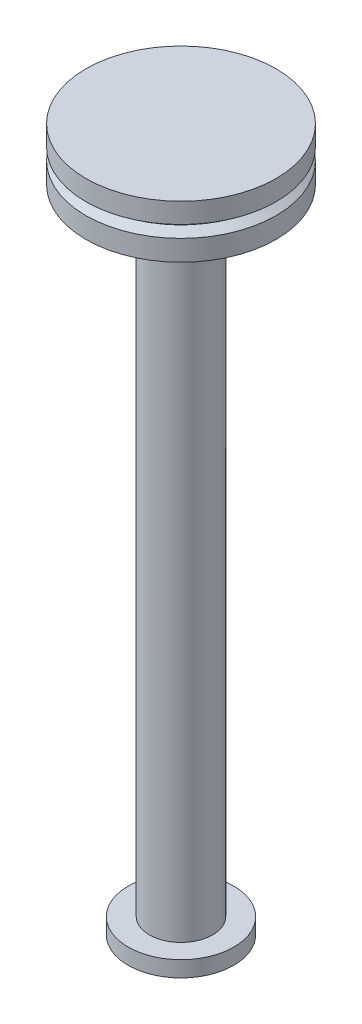
ISO-10303-21;
HEADER;
FILE_DESCRIPTION(('STEP AP214'),'2;1');
FILE_NAME('part.step','',(''),(''),'','','');
FILE_SCHEMA(('AUTOMOTIVE_DESIGN { 1 0 10303 214 1 1 1 1 }'));
ENDSEC;
DATA;
#1=APPLICATION_CONTEXT('core data for automotive mechanical design processes');
#2=APPLICATION_PROTOCOL_DEFINITION('international standard','automotive_design',2000,#1);
#3=PRODUCT_CONTEXT('',#1,'mechanical');
#4=PRODUCT('Part','Part','',(#3));
#5=PRODUCT_RELATED_PRODUCT_CATEGORY('part','',(#4));
#6=PRODUCT_DEFINITION_FORMATION('','',#4);
#7=PRODUCT_DEFINITION_CONTEXT('part definition',#1,'design');
#8=PRODUCT_DEFINITION('design','',#6,#7);
#9=PRODUCT_DEFINITION_SHAPE('','',#8);
#10=(LENGTH_UNIT() NAMED_UNIT(*) SI_UNIT(.MILLI.,.METRE.));
#11=(NAMED_UNIT(*) PLANE_ANGLE_UNIT() SI_UNIT($,.RADIAN.));
#12=(NAMED_UNIT(*) SI_UNIT($,.STERADIAN.) SOLID_ANGLE_UNIT());
#13=UNCERTAINTY_MEASURE_WITH_UNIT(LENGTH_MEASURE(1.E-05),#10,'distance_accuracy_value','');
#14=(GEOMETRIC_REPRESENTATION_CONTEXT(3) GLOBAL_UNCERTAINTY_ASSIGNED_CONTEXT((#13)) GLOBAL_UNIT_ASSIGNED_CONTEXT((#10,
#11,#12)) REPRESENTATION_CONTEXT('',''));
#15=CARTESIAN_POINT('',(0.,0.,0.));
#16=DIRECTION('',(0.,0.,1.));
#17=DIRECTION('',(1.,0.,0.));
#18=AXIS2_PLACEMENT_3D('',#15,#16,#17);
#19=CARTESIAN_POINT('',(0.,0.,0.));
#20=DIRECTION('',(0.,-1.,0.));
#21=DIRECTION('',(0.,0.,-1.));
#22=AXIS2_PLACEMENT_3D('',#19,#20,#21);
#23=CYLINDRICAL_SURFACE('',#22,5.99999999999999);
#24=CARTESIAN_POINT('',(0.,0.,0.));
#25=DIRECTION('',(0.,-1.,0.));
#26=DIRECTION('',(0.,0.,-1.));
#27=AXIS2_PLACEMENT_3D('',#24,#25,#26);
#28=CIRCLE('',#27,6.);
#29=CARTESIAN_POINT('',(0.,0.,-6.));
#30=VERTEX_POINT('',#29);
#31=EDGE_CURVE('E10',#30,#30,#28,.T.);
#32=ORIENTED_EDGE('',*,*,#31,.F.);
#33=EDGE_LOOP('',(#32));
#34=FACE_BOUND('',#33,.T.);
#35=CARTESIAN_POINT('',(0.,120.,0.));
#36=DIRECTION('',(0.,1.,0.));
#37=DIRECTION('',(-1.,0.,0.));
#38=AXIS2_PLACEMENT_3D('',#35,#36,#37);
#39=CIRCLE('',#38,5.99999999999999);
#40=CARTESIAN_POINT('',(-5.99999999999999,120.,0.));
#41=VERTEX_POINT('',#40);
#42=EDGE_CURVE('E41',#41,#41,#39,.F.);
#43=ORIENTED_EDGE('',*,*,#42,.T.);
#44=EDGE_LOOP('',(#43));
#45=FACE_BOUND('',#44,.T.);
#46=ADVANCED_FACE('F37',(#34,#45),#23,.T.);
#47=CARTESIAN_POINT('',(0.,120.,0.));
#48=DIRECTION('',(0.,1.,0.));
#49=DIRECTION('',(-1.,0.,0.));
#50=AXIS2_PLACEMENT_3D('',#47,#48,#49);
#51=PLANE('',#50);
#52=ORIENTED_EDGE('',*,*,#42,.F.);
#53=EDGE_LOOP('',(#52));
#54=FACE_BOUND('',#53,.T.);
#55=CARTESIAN_POINT('',(0.,120.,0.));
#56=DIRECTION('',(0.,1.,0.));
#57=DIRECTION('',(-1.,0.,0.));
#58=AXIS2_PLACEMENT_3D('',#55,#56,#57);
#59=CIRCLE('',#58,18.);
#60=CARTESIAN_POINT('',(-18.,120.,0.));
#61=VERTEX_POINT('',#60);
#62=EDGE_CURVE('E48',#61,#61,#59,.T.);
#63=ORIENTED_EDGE('',*,*,#62,.F.);
#64=EDGE_LOOP('',(#63));
#65=FACE_BOUND('',#64,.T.);
#66=ADVANCED_FACE('F87',(#54,#65),#51,.F.);
#67=CARTESIAN_POINT('',(0.,130.,0.));
#68=DIRECTION('',(0.,1.,0.));
#69=DIRECTION('',(-1.,0.,0.));
#70=AXIS2_PLACEMENT_3D('',#67,#68,#69);
#71=CYLINDRICAL_SURFACE('',#70,18.);
#72=CARTESIAN_POINT('',(0.,123.913651393153,0.));
#73=DIRECTION('',(0.,1.,0.));
#74=DIRECTION('',(-1.,0.,0.));
#75=AXIS2_PLACEMENT_3D('',#72,#73,#74);
#76=CIRCLE('',#75,18.);
#77=CARTESIAN_POINT('',(-18.,123.913651393153,0.));
#78=VERTEX_POINT('',#77);
#79=EDGE_CURVE('E52',#78,#78,#76,.T.);
#80=ORIENTED_EDGE('',*,*,#79,.F.);
#81=EDGE_LOOP('',(#80));
#82=FACE_BOUND('',#81,.T.);
#83=ORIENTED_EDGE('',*,*,#62,.T.);
#84=EDGE_LOOP('',(#83));
#85=FACE_BOUND('',#84,.T.);
#86=ADVANCED_FACE('F92',(#82,#85),#71,.T.);
#87=CARTESIAN_POINT('',(0.,123.913651393153,0.));
#88=DIRECTION('',(0.,-1.,0.));
#89=DIRECTION('',(1.,0.,0.));
#90=AXIS2_PLACEMENT_3D('',#87,#88,#89);
#91=CONICAL_SURFACE('',#90,18.,0.968952365104869);
#92=CARTESIAN_POINT('',(0.,125.,0.));
#93=DIRECTION('',(0.,1.,0.));
#94=DIRECTION('',(-1.,0.,0.));
#95=AXIS2_PLACEMENT_3D('',#92,#93,#94);
#96=CIRCLE('',#95,16.4183548626294);
#97=CARTESIAN_POINT('',(-16.4183548626294,125.,0.));
#98=VERTEX_POINT('',#97);
#99=EDGE_CURVE('E55',#98,#98,#96,.T.);
#100=ORIENTED_EDGE('',*,*,#99,.F.);
#101=EDGE_LOOP('',(#100));
#102=FACE_BOUND('',#101,.T.);
#103=ORIENTED_EDGE('',*,*,#79,.T.);
#104=EDGE_LOOP('',(#103));
#105=FACE_BOUND('',#104,.T.);
#106=ADVANCED_FACE('F99',(#102,#105),#91,.T.);
#107=CARTESIAN_POINT('',(0.,125.,0.));
#108=DIRECTION('',(0.,1.,0.));
#109=DIRECTION('',(-1.,0.,0.));
#110=AXIS2_PLACEMENT_3D('',#107,#108,#109);
#111=CONICAL_SURFACE('',#110,16.4183548626294,0.927466726286363);
#112=CARTESIAN_POINT('',(0.,126.185810055593,0.));
#113=DIRECTION('',(0.,1.,0.));
#114=DIRECTION('',(-1.,0.,0.));
#115=AXIS2_PLACEMENT_3D('',#112,#113,#114);
#116=CIRCLE('',#115,18.);
#117=CARTESIAN_POINT('',(-18.,126.185810055593,0.));
#118=VERTEX_POINT('',#117);
#119=EDGE_CURVE('E58',#118,#118,#116,.T.);
#120=ORIENTED_EDGE('',*,*,#119,.F.);
#121=EDGE_LOOP('',(#120));
#122=FACE_BOUND('',#121,.T.);
#123=ORIENTED_EDGE('',*,*,#99,.T.);
#124=EDGE_LOOP('',(#123));
#125=FACE_BOUND('',#124,.T.);
#126=ADVANCED_FACE('F103',(#122,#125),#111,.T.);
#127=CARTESIAN_POINT('',(0.,130.,0.));
#128=DIRECTION('',(0.,1.,0.));
#129=DIRECTION('',(-1.,0.,0.));
#130=AXIS2_PLACEMENT_3D('',#127,#128,#129);
#131=CYLINDRICAL_SURFACE('',#130,18.);
#132=CARTESIAN_POINT('',(0.,130.,0.));
#133=DIRECTION('',(0.,1.,0.));
#134=DIRECTION('',(-1.,0.,0.));
#135=AXIS2_PLACEMENT_3D('',#132,#133,#134);
#136=CIRCLE('',#135,18.);
#137=CARTESIAN_POINT('',(-18.,130.,0.));
#138=VERTEX_POINT('',#137);
#139=EDGE_CURVE('E61',#138,#138,#136,.T.);
#140=ORIENTED_EDGE('',*,*,#139,.F.);
#141=EDGE_LOOP('',(#140));
#142=FACE_BOUND('',#141,.T.);
#143=ORIENTED_EDGE('',*,*,#119,.T.);
#144=EDGE_LOOP('',(#143));
#145=FACE_BOUND('',#144,.T.);
#146=ADVANCED_FACE('F107',(#142,#145),#131,.T.);
#147=CARTESIAN_POINT('',(0.,130.,0.));
#148=DIRECTION('',(0.,1.,0.));
#149=DIRECTION('',(0.,0.,1.));
#150=AXIS2_PLACEMENT_3D('',#147,#148,#149);
#151=PLANE('',#150);
#152=ORIENTED_EDGE('',*,*,#139,.T.);
#153=EDGE_LOOP('',(#152));
#154=FACE_BOUND('',#153,.T.);
#155=ADVANCED_FACE('F39',(#154),#151,.T.);
#156=CARTESIAN_POINT('',(0.,-3.,0.));
#157=DIRECTION('',(0.,1.,0.));
#158=DIRECTION('',(0.,0.,1.));
#159=AXIS2_PLACEMENT_3D('',#156,#157,#158);
#160=CYLINDRICAL_SURFACE('',#159,10.);
#161=CARTESIAN_POINT('',(0.,-3.,0.));
#162=DIRECTION('',(0.,-1.,0.));
#163=DIRECTION('',(0.,0.,-1.));
#164=AXIS2_PLACEMENT_3D('',#161,#162,#163);
#165=CIRCLE('',#164,10.);
#166=CARTESIAN_POINT('',(0.,-3.,-10.));
#167=VERTEX_POINT('',#166);
#168=EDGE_CURVE('E64',#167,#167,#165,.T.);
#169=ORIENTED_EDGE('',*,*,#168,.F.);
#170=EDGE_LOOP('',(#169));
#171=FACE_BOUND('',#170,.T.);
#172=CARTESIAN_POINT('',(0.,0.,0.));
#173=DIRECTION('',(0.,-1.,0.));
#174=DIRECTION('',(0.,0.,-1.));
#175=AXIS2_PLACEMENT_3D('',#172,#173,#174);
#176=CIRCLE('',#175,10.);
#177=CARTESIAN_POINT('',(0.,0.,-10.));
#178=VERTEX_POINT('',#177);
#179=EDGE_CURVE('E65',#178,#178,#176,.T.);
#180=ORIENTED_EDGE('',*,*,#179,.T.);
#181=EDGE_LOOP('',(#180));
#182=FACE_BOUND('',#181,.T.);
#183=ADVANCED_FACE('F73',(#171,#182),#160,.T.);
#184=CARTESIAN_POINT('',(0.,-3.,0.));
#185=DIRECTION('',(0.,-1.,0.));
#186=DIRECTION('',(0.,0.,-1.));
#187=AXIS2_PLACEMENT_3D('',#184,#185,#186);
#188=PLANE('',#187);
#189=ORIENTED_EDGE('',*,*,#168,.T.);
#190=EDGE_LOOP('',(#189));
#191=FACE_BOUND('',#190,.T.);
#192=ADVANCED_FACE('F71',(#191),#188,.T.);
#193=CARTESIAN_POINT('',(0.,0.,0.));
#194=DIRECTION('',(0.,-1.,0.));
#195=DIRECTION('',(0.,0.,-1.));
#196=AXIS2_PLACEMENT_3D('',#193,#194,#195);
#197=PLANE('',#196);
#198=ORIENTED_EDGE('',*,*,#31,.T.);
#199=EDGE_LOOP('',(#198));
#200=FACE_BOUND('',#199,.T.);
#201=ORIENTED_EDGE('',*,*,#179,.F.);
#202=EDGE_LOOP('',(#201));
#203=FACE_BOUND('',#202,.T.);
#204=ADVANCED_FACE('F79',(#200,#203),#197,.F.);
#205=CLOSED_SHELL('',(#46,#66,#86,#106,#126,#146,#155,#183,#192,#204));
#206=MANIFOLD_SOLID_BREP('B2',#205);
#207=ADVANCED_BREP_SHAPE_REPRESENTATION('',(#18,#206),#14);
#208=SHAPE_DEFINITION_REPRESENTATION(#9,#207);
ENDSEC;
END-ISO-10303-21;
